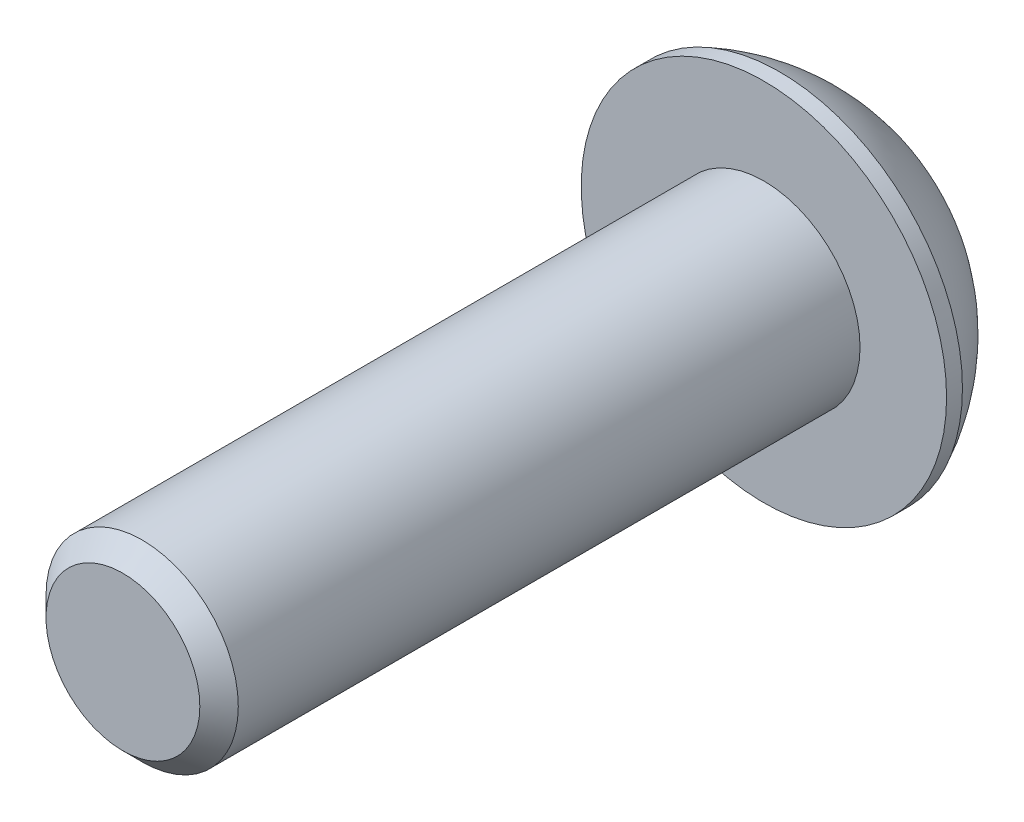
ISO-10303-21;
HEADER;
FILE_DESCRIPTION(('STEP AP214'),'2;1');
FILE_NAME('part.step','',(''),(''),'','','');
FILE_SCHEMA(('AUTOMOTIVE_DESIGN { 1 0 10303 214 1 1 1 1 }'));
ENDSEC;
DATA;
#1=APPLICATION_CONTEXT('core data for automotive mechanical design processes');
#2=APPLICATION_PROTOCOL_DEFINITION('international standard','automotive_design',2000,#1);
#3=PRODUCT_CONTEXT('',#1,'mechanical');
#4=PRODUCT('Part','Part','',(#3));
#5=PRODUCT_RELATED_PRODUCT_CATEGORY('part','',(#4));
#6=PRODUCT_DEFINITION_FORMATION('','',#4);
#7=PRODUCT_DEFINITION_CONTEXT('part definition',#1,'design');
#8=PRODUCT_DEFINITION('design','',#6,#7);
#9=PRODUCT_DEFINITION_SHAPE('','',#8);
#10=(LENGTH_UNIT() NAMED_UNIT(*) SI_UNIT(.MILLI.,.METRE.));
#11=(NAMED_UNIT(*) PLANE_ANGLE_UNIT() SI_UNIT($,.RADIAN.));
#12=(NAMED_UNIT(*) SI_UNIT($,.STERADIAN.) SOLID_ANGLE_UNIT());
#13=UNCERTAINTY_MEASURE_WITH_UNIT(LENGTH_MEASURE(1.E-05),#10,'distance_accuracy_value','');
#14=(GEOMETRIC_REPRESENTATION_CONTEXT(3) GLOBAL_UNCERTAINTY_ASSIGNED_CONTEXT((#13)) GLOBAL_UNIT_ASSIGNED_CONTEXT((#10,
#11,#12)) REPRESENTATION_CONTEXT('',''));
#15=CARTESIAN_POINT('',(0.,0.,0.));
#16=DIRECTION('',(0.,0.,1.));
#17=DIRECTION('',(1.,0.,0.));
#18=AXIS2_PLACEMENT_3D('',#15,#16,#17);
#19=CARTESIAN_POINT('',(0.,-1.15470053837925,1.155));
#20=DIRECTION('',(-0.5,-0.866025403784439,0.));
#21=DIRECTION('',(-0.866025403784439,0.5,0.));
#22=AXIS2_PLACEMENT_3D('',#19,#20,#21);
#23=PLANE('',#22);
#24=DIRECTION('',(0.,0.,-1.));
#25=VECTOR('',#24,1.);
#26=CARTESIAN_POINT('',(0.,-1.15470053837925,1.155));
#27=LINE('',#26,#25);
#28=CARTESIAN_POINT('',(0.,-1.15470053837925,1.155));
#29=VERTEX_POINT('',#28);
#30=CARTESIAN_POINT('',(0.,-1.15470053837925,0.));
#31=VERTEX_POINT('',#30);
#32=EDGE_CURVE('E11',#29,#31,#27,.T.);
#33=ORIENTED_EDGE('',*,*,#32,.T.);
#34=CARTESIAN_POINT('',(0.,-1.15470053837922,0.));
#35=CARTESIAN_POINT('',(-0.500000000000002,-0.866025403784439,0.288675134594791));
#36=CARTESIAN_POINT('',(-0.999999999999949,-0.577350269189654,0.));
#37=(BOUNDED_CURVE() B_SPLINE_CURVE(2,(#34,#35,#36),.UNSPECIFIED.,.F.,
.F.) B_SPLINE_CURVE_WITH_KNOTS((3,3),(-0.321867155116299,-0.124274873543865),
.UNSPECIFIED.) CURVE() GEOMETRIC_REPRESENTATION_ITEM() RATIONAL_B_SPLINE_CURVE((1.46410161513778,
1.69059892324148,1.46410161513778)) REPRESENTATION_ITEM(''));
#38=CARTESIAN_POINT('',(-1.,-0.577350269189626,0.));
#39=VERTEX_POINT('',#38);
#40=EDGE_CURVE('E220',#31,#39,#37,.T.);
#41=ORIENTED_EDGE('',*,*,#40,.T.);
#42=DIRECTION('',(0.,0.,-1.));
#43=VECTOR('',#42,1.);
#44=CARTESIAN_POINT('',(-1.,-0.577350269189626,1.155));
#45=LINE('',#44,#43);
#46=CARTESIAN_POINT('',(-1.,-0.577350269189626,1.155));
#47=VERTEX_POINT('',#46);
#48=EDGE_CURVE('E250',#47,#39,#45,.T.);
#49=ORIENTED_EDGE('',*,*,#48,.F.);
#50=DIRECTION('',(-0.866025403784439,0.5,0.));
#51=VECTOR('',#50,1.);
#52=CARTESIAN_POINT('',(0.,-1.15470053837925,1.155));
#53=LINE('',#52,#51);
#54=EDGE_CURVE('E229',#29,#47,#53,.T.);
#55=ORIENTED_EDGE('',*,*,#54,.F.);
#56=EDGE_LOOP('',(#33,#41,#49,#55));
#57=FACE_BOUND('',#56,.T.);
#58=ADVANCED_FACE('F17',(#57),#23,.F.);
#59=CARTESIAN_POINT('',(1.,-0.577350269189626,1.155));
#60=DIRECTION('',(0.5,-0.866025403784439,0.));
#61=DIRECTION('',(0.,0.,-1.));
#62=AXIS2_PLACEMENT_3D('',#59,#60,#61);
#63=PLANE('',#62);
#64=DIRECTION('',(0.,0.,-1.));
#65=VECTOR('',#64,1.);
#66=CARTESIAN_POINT('',(1.,-0.577350269189626,1.155));
#67=LINE('',#66,#65);
#68=CARTESIAN_POINT('',(1.,-0.577350269189626,1.155));
#69=VERTEX_POINT('',#68);
#70=CARTESIAN_POINT('',(1.,-0.577350269189626,0.));
#71=VERTEX_POINT('',#70);
#72=EDGE_CURVE('E25',#69,#71,#67,.T.);
#73=ORIENTED_EDGE('',*,*,#72,.T.);
#74=CARTESIAN_POINT('',(0.999999999999948,-0.577350269189655,0.));
#75=CARTESIAN_POINT('',(0.5,-0.866025403784439,0.288675134594789));
#76=CARTESIAN_POINT('',(0.,-1.15470053837922,0.));
#77=(BOUNDED_CURVE() B_SPLINE_CURVE(2,(#74,#75,#76),.UNSPECIFIED.,.F.,
.F.) B_SPLINE_CURVE_WITH_KNOTS((3,3),(-0.321867155116299,-0.124274873543865),
.UNSPECIFIED.) CURVE() GEOMETRIC_REPRESENTATION_ITEM() RATIONAL_B_SPLINE_CURVE((1.46410161513778,
1.69059892324148,1.46410161513778)) REPRESENTATION_ITEM(''));
#78=EDGE_CURVE('E211',#71,#31,#77,.T.);
#79=ORIENTED_EDGE('',*,*,#78,.T.);
#80=ORIENTED_EDGE('',*,*,#32,.F.);
#81=DIRECTION('',(-0.866025403784439,-0.5,0.));
#82=VECTOR('',#81,1.);
#83=CARTESIAN_POINT('',(1.,-0.577350269189626,1.155));
#84=LINE('',#83,#82);
#85=EDGE_CURVE('E138',#69,#29,#84,.T.);
#86=ORIENTED_EDGE('',*,*,#85,.F.);
#87=EDGE_LOOP('',(#73,#79,#80,#86));
#88=FACE_BOUND('',#87,.T.);
#89=ADVANCED_FACE('F264',(#88),#63,.F.);
#90=CARTESIAN_POINT('',(1.,0.577350269189626,1.155));
#91=DIRECTION('',(1.,0.,0.));
#92=DIRECTION('',(0.,0.,1.));
#93=AXIS2_PLACEMENT_3D('',#90,#91,#92);
#94=PLANE('',#93);
#95=DIRECTION('',(0.,0.,-1.));
#96=VECTOR('',#95,1.);
#97=CARTESIAN_POINT('',(1.,0.577350269189626,1.155));
#98=LINE('',#97,#96);
#99=CARTESIAN_POINT('',(1.,0.577350269189626,1.155));
#100=VERTEX_POINT('',#99);
#101=CARTESIAN_POINT('',(1.,0.577350269189626,0.));
#102=VERTEX_POINT('',#101);
#103=EDGE_CURVE('E46',#100,#102,#98,.T.);
#104=ORIENTED_EDGE('',*,*,#103,.T.);
#105=CARTESIAN_POINT('',(1.,0.577350269189569,0.));
#106=CARTESIAN_POINT('',(1.,0.,0.288675134594791));
#107=CARTESIAN_POINT('',(1.,-0.577350269189568,0.));
#108=(BOUNDED_CURVE() B_SPLINE_CURVE(2,(#105,#106,#107),.UNSPECIFIED.,.F.,
.F.) B_SPLINE_CURVE_WITH_KNOTS((3,3),(-0.3218671551163,-0.124274873543865),
.UNSPECIFIED.) CURVE() GEOMETRIC_REPRESENTATION_ITEM() RATIONAL_B_SPLINE_CURVE((1.46410161513777,
1.69059892324148,1.46410161513777)) REPRESENTATION_ITEM(''));
#109=EDGE_CURVE('E203',#102,#71,#108,.T.);
#110=ORIENTED_EDGE('',*,*,#109,.T.);
#111=ORIENTED_EDGE('',*,*,#72,.F.);
#112=DIRECTION('',(0.,-1.,0.));
#113=VECTOR('',#112,1.);
#114=CARTESIAN_POINT('',(1.,0.577350269189626,1.155));
#115=LINE('',#114,#113);
#116=EDGE_CURVE('E135',#100,#69,#115,.T.);
#117=ORIENTED_EDGE('',*,*,#116,.F.);
#118=EDGE_LOOP('',(#104,#110,#111,#117));
#119=FACE_BOUND('',#118,.T.);
#120=ADVANCED_FACE('F270',(#119),#94,.F.);
#121=CARTESIAN_POINT('',(0.,1.15470053837925,1.155));
#122=DIRECTION('',(0.5,0.866025403784439,0.));
#123=DIRECTION('',(0.,0.,-1.));
#124=AXIS2_PLACEMENT_3D('',#121,#122,#123);
#125=PLANE('',#124);
#126=DIRECTION('',(0.,0.,-1.));
#127=VECTOR('',#126,1.);
#128=CARTESIAN_POINT('',(0.,1.15470053837925,1.155));
#129=LINE('',#128,#127);
#130=CARTESIAN_POINT('',(0.,1.15470053837925,1.155));
#131=VERTEX_POINT('',#130);
#132=CARTESIAN_POINT('',(0.,1.15470053837925,0.));
#133=VERTEX_POINT('',#132);
#134=EDGE_CURVE('E256',#131,#133,#129,.T.);
#135=ORIENTED_EDGE('',*,*,#134,.T.);
#136=CARTESIAN_POINT('',(0.,1.15470053837922,0.));
#137=CARTESIAN_POINT('',(0.5,0.866025403784439,0.288675134594791));
#138=CARTESIAN_POINT('',(0.999999999999951,0.577350269189654,0.));
#139=(BOUNDED_CURVE() B_SPLINE_CURVE(2,(#136,#137,#138),.UNSPECIFIED.,.F.,
.F.) B_SPLINE_CURVE_WITH_KNOTS((3,3),(-0.3218671551163,-0.124274873543865),
.UNSPECIFIED.) CURVE() GEOMETRIC_REPRESENTATION_ITEM() RATIONAL_B_SPLINE_CURVE((1.46410161513778,
1.69059892324148,1.46410161513778)) REPRESENTATION_ITEM(''));
#140=EDGE_CURVE('E195',#133,#102,#139,.T.);
#141=ORIENTED_EDGE('',*,*,#140,.T.);
#142=ORIENTED_EDGE('',*,*,#103,.F.);
#143=DIRECTION('',(0.866025403784439,-0.5,0.));
#144=VECTOR('',#143,1.);
#145=CARTESIAN_POINT('',(0.,1.15470053837925,1.155));
#146=LINE('',#145,#144);
#147=EDGE_CURVE('E139',#131,#100,#146,.T.);
#148=ORIENTED_EDGE('',*,*,#147,.F.);
#149=EDGE_LOOP('',(#135,#141,#142,#148));
#150=FACE_BOUND('',#149,.T.);
#151=ADVANCED_FACE('F312',(#150),#125,.F.);
#152=CARTESIAN_POINT('',(-1.,0.577350269189626,1.155));
#153=DIRECTION('',(-0.5,0.866025403784439,0.));
#154=DIRECTION('',(0.,0.,1.));
#155=AXIS2_PLACEMENT_3D('',#152,#153,#154);
#156=PLANE('',#155);
#157=DIRECTION('',(0.,0.,-1.));
#158=VECTOR('',#157,1.);
#159=CARTESIAN_POINT('',(-1.,0.577350269189626,1.155));
#160=LINE('',#159,#158);
#161=CARTESIAN_POINT('',(-1.,0.577350269189626,1.155));
#162=VERTEX_POINT('',#161);
#163=CARTESIAN_POINT('',(-1.,0.577350269189626,0.));
#164=VERTEX_POINT('',#163);
#165=EDGE_CURVE('E253',#162,#164,#160,.T.);
#166=ORIENTED_EDGE('',*,*,#165,.T.);
#167=CARTESIAN_POINT('',(-0.999999999999952,0.577350269189653,0.));
#168=CARTESIAN_POINT('',(-0.5,0.866025403784439,0.288675134594791));
#169=CARTESIAN_POINT('',(0.,1.15470053837922,0.));
#170=(BOUNDED_CURVE() B_SPLINE_CURVE(2,(#167,#168,#169),.UNSPECIFIED.,.F.,
.F.) B_SPLINE_CURVE_WITH_KNOTS((3,3),(-0.3218671551163,-0.124274873543865),
.UNSPECIFIED.) CURVE() GEOMETRIC_REPRESENTATION_ITEM() RATIONAL_B_SPLINE_CURVE((1.46410161513778,
1.69059892324148,1.46410161513778)) REPRESENTATION_ITEM(''));
#171=EDGE_CURVE('E162',#164,#133,#170,.T.);
#172=ORIENTED_EDGE('',*,*,#171,.T.);
#173=ORIENTED_EDGE('',*,*,#134,.F.);
#174=DIRECTION('',(0.866025403784439,0.5,0.));
#175=VECTOR('',#174,1.);
#176=CARTESIAN_POINT('',(-1.,0.577350269189626,1.155));
#177=LINE('',#176,#175);
#178=EDGE_CURVE('E240',#162,#131,#177,.T.);
#179=ORIENTED_EDGE('',*,*,#178,.F.);
#180=EDGE_LOOP('',(#166,#172,#173,#179));
#181=FACE_BOUND('',#180,.T.);
#182=ADVANCED_FACE('F316',(#181),#156,.F.);
#183=CARTESIAN_POINT('',(-1.,-0.577350269189626,1.155));
#184=DIRECTION('',(-1.,0.,0.));
#185=DIRECTION('',(0.,0.,1.));
#186=AXIS2_PLACEMENT_3D('',#183,#184,#185);
#187=PLANE('',#186);
#188=ORIENTED_EDGE('',*,*,#48,.T.);
#189=CARTESIAN_POINT('',(-1.,-0.577350269189568,0.));
#190=CARTESIAN_POINT('',(-1.,0.,0.288675134594789));
#191=CARTESIAN_POINT('',(-1.,0.577350269189568,0.));
#192=(BOUNDED_CURVE() B_SPLINE_CURVE(2,(#189,#190,#191),.UNSPECIFIED.,.F.,
.F.) B_SPLINE_CURVE_WITH_KNOTS((3,3),(-0.321867155116299,-0.124274873543865),
.UNSPECIFIED.) CURVE() GEOMETRIC_REPRESENTATION_ITEM() RATIONAL_B_SPLINE_CURVE((1.46410161513777,
1.69059892324148,1.46410161513777)) REPRESENTATION_ITEM(''));
#193=EDGE_CURVE('E146',#39,#164,#192,.T.);
#194=ORIENTED_EDGE('',*,*,#193,.T.);
#195=ORIENTED_EDGE('',*,*,#165,.F.);
#196=DIRECTION('',(0.,1.,0.));
#197=VECTOR('',#196,1.);
#198=CARTESIAN_POINT('',(-1.,-0.577350269189626,1.155));
#199=LINE('',#198,#197);
#200=EDGE_CURVE('E236',#47,#162,#199,.T.);
#201=ORIENTED_EDGE('',*,*,#200,.F.);
#202=EDGE_LOOP('',(#188,#194,#195,#201));
#203=FACE_BOUND('',#202,.T.);
#204=ADVANCED_FACE('F307',(#203),#187,.F.);
#205=CARTESIAN_POINT('',(-1.,-0.577350269189625,1.155));
#206=DIRECTION('',(0.,0.,-1.));
#207=DIRECTION('',(0.,-1.,0.));
#208=AXIS2_PLACEMENT_3D('',#205,#206,#207);
#209=PLANE('',#208);
#210=ORIENTED_EDGE('',*,*,#54,.T.);
#211=ORIENTED_EDGE('',*,*,#200,.T.);
#212=ORIENTED_EDGE('',*,*,#178,.T.);
#213=ORIENTED_EDGE('',*,*,#147,.T.);
#214=ORIENTED_EDGE('',*,*,#116,.T.);
#215=ORIENTED_EDGE('',*,*,#85,.T.);
#216=EDGE_LOOP('',(#210,#211,#212,#213,#214,#215));
#217=FACE_BOUND('',#216,.T.);
#218=ADVANCED_FACE('F311',(#217),#209,.T.);
#219=CARTESIAN_POINT('',(0.,0.,0.));
#220=DIRECTION('',(0.,0.,-1.));
#221=DIRECTION('',(-1.,0.,0.));
#222=AXIS2_PLACEMENT_3D('',#219,#220,#221);
#223=CONICAL_SURFACE('',#222,1.15470053837925,0.78539816339745);
#224=CARTESIAN_POINT('',(0.,0.,0.));
#225=DIRECTION('',(0.,0.,-1.));
#226=DIRECTION('',(-1.,0.,0.));
#227=AXIS2_PLACEMENT_3D('',#224,#225,#226);
#228=CIRCLE('',#227,1.15470053837925);
#229=EDGE_CURVE('E163',#31,#39,#228,.T.);
#230=ORIENTED_EDGE('',*,*,#229,.T.);
#231=ORIENTED_EDGE('',*,*,#40,.F.);
#232=EDGE_LOOP('',(#230,#231));
#233=FACE_BOUND('',#232,.T.);
#234=ADVANCED_FACE('F290',(#233),#223,.F.);
#235=CARTESIAN_POINT('',(0.,0.,0.));
#236=DIRECTION('',(0.,0.,-1.));
#237=DIRECTION('',(-1.,0.,0.));
#238=AXIS2_PLACEMENT_3D('',#235,#236,#237);
#239=CONICAL_SURFACE('',#238,1.15470053837925,0.78539816339745);
#240=CARTESIAN_POINT('',(0.,0.,0.));
#241=DIRECTION('',(0.,0.,-1.));
#242=DIRECTION('',(-1.,0.,0.));
#243=AXIS2_PLACEMENT_3D('',#240,#241,#242);
#244=CIRCLE('',#243,1.15470053837925);
#245=EDGE_CURVE('E158',#71,#31,#244,.T.);
#246=ORIENTED_EDGE('',*,*,#245,.T.);
#247=ORIENTED_EDGE('',*,*,#78,.F.);
#248=EDGE_LOOP('',(#246,#247));
#249=FACE_BOUND('',#248,.T.);
#250=ADVANCED_FACE('F266',(#249),#239,.F.);
#251=CARTESIAN_POINT('',(0.,0.,0.));
#252=DIRECTION('',(0.,0.,-1.));
#253=DIRECTION('',(1.,0.,0.));
#254=AXIS2_PLACEMENT_3D('',#251,#252,#253);
#255=CONICAL_SURFACE('',#254,1.15470053837925,0.78539816339745);
#256=CARTESIAN_POINT('',(0.,0.,0.));
#257=DIRECTION('',(0.,0.,-1.));
#258=DIRECTION('',(-1.,0.,0.));
#259=AXIS2_PLACEMENT_3D('',#256,#257,#258);
#260=CIRCLE('',#259,1.15470053837925);
#261=EDGE_CURVE('E175',#102,#71,#260,.T.);
#262=ORIENTED_EDGE('',*,*,#261,.T.);
#263=ORIENTED_EDGE('',*,*,#109,.F.);
#264=EDGE_LOOP('',(#262,#263));
#265=FACE_BOUND('',#264,.T.);
#266=ADVANCED_FACE('F278',(#265),#255,.F.);
#267=CARTESIAN_POINT('',(0.,0.,0.));
#268=DIRECTION('',(0.,0.,-1.));
#269=DIRECTION('',(-1.,0.,0.));
#270=AXIS2_PLACEMENT_3D('',#267,#268,#269);
#271=CONICAL_SURFACE('',#270,1.15470053837925,0.78539816339745);
#272=CARTESIAN_POINT('',(0.,0.,0.));
#273=DIRECTION('',(0.,0.,-1.));
#274=DIRECTION('',(-1.,0.,0.));
#275=AXIS2_PLACEMENT_3D('',#272,#273,#274);
#276=CIRCLE('',#275,1.15470053837925);
#277=EDGE_CURVE('E179',#133,#102,#276,.T.);
#278=ORIENTED_EDGE('',*,*,#277,.T.);
#279=ORIENTED_EDGE('',*,*,#140,.F.);
#280=EDGE_LOOP('',(#278,#279));
#281=FACE_BOUND('',#280,.T.);
#282=ADVANCED_FACE('F280',(#281),#271,.F.);
#283=CARTESIAN_POINT('',(0.,0.,0.));
#284=DIRECTION('',(0.,0.,-1.));
#285=DIRECTION('',(-1.,0.,0.));
#286=AXIS2_PLACEMENT_3D('',#283,#284,#285);
#287=CONICAL_SURFACE('',#286,1.15470053837925,0.78539816339745);
#288=CARTESIAN_POINT('',(0.,0.,0.));
#289=DIRECTION('',(0.,0.,-1.));
#290=DIRECTION('',(-1.,0.,0.));
#291=AXIS2_PLACEMENT_3D('',#288,#289,#290);
#292=CIRCLE('',#291,1.15470053837925);
#293=EDGE_CURVE('E183',#164,#133,#292,.T.);
#294=ORIENTED_EDGE('',*,*,#293,.T.);
#295=ORIENTED_EDGE('',*,*,#171,.F.);
#296=EDGE_LOOP('',(#294,#295));
#297=FACE_BOUND('',#296,.T.);
#298=ADVANCED_FACE('F287',(#297),#287,.F.);
#299=CARTESIAN_POINT('',(0.,-2.85,1.65));
#300=DIRECTION('',(0.,0.,-1.));
#301=DIRECTION('',(0.,-1.,0.));
#302=AXIS2_PLACEMENT_3D('',#299,#300,#301);
#303=PLANE('',#302);
#304=CARTESIAN_POINT('',(0.,0.,1.65));
#305=DIRECTION('',(0.,0.,-1.));
#306=DIRECTION('',(-1.,0.,0.));
#307=AXIS2_PLACEMENT_3D('',#304,#305,#306);
#308=CIRCLE('',#307,1.5);
#309=CARTESIAN_POINT('',(1.5,0.,1.65));
#310=VERTEX_POINT('',#309);
#311=EDGE_CURVE('E117',#310,#310,#308,.T.);
#312=ORIENTED_EDGE('',*,*,#311,.T.);
#313=EDGE_LOOP('',(#312));
#314=FACE_BOUND('',#313,.T.);
#315=CARTESIAN_POINT('',(0.,0.,1.65));
#316=DIRECTION('',(0.,0.,-1.));
#317=DIRECTION('',(-1.,0.,0.));
#318=AXIS2_PLACEMENT_3D('',#315,#316,#317);
#319=CIRCLE('',#318,2.85);
#320=CARTESIAN_POINT('',(2.85,0.,1.65));
#321=VERTEX_POINT('',#320);
#322=EDGE_CURVE('E143',#321,#321,#319,.T.);
#323=ORIENTED_EDGE('',*,*,#322,.F.);
#324=EDGE_LOOP('',(#323));
#325=FACE_BOUND('',#324,.T.);
#326=ADVANCED_FACE('F319',(#314,#325),#303,.F.);
#327=CARTESIAN_POINT('',(0.,-1.5,0.));
#328=DIRECTION('',(0.,0.,1.));
#329=DIRECTION('',(1.,0.,0.));
#330=AXIS2_PLACEMENT_3D('',#327,#328,#329);
#331=PLANE('',#330);
#332=ORIENTED_EDGE('',*,*,#261,.F.);
#333=ORIENTED_EDGE('',*,*,#277,.F.);
#334=ORIENTED_EDGE('',*,*,#293,.F.);
#335=CARTESIAN_POINT('',(0.,0.,0.));
#336=DIRECTION('',(0.,0.,-1.));
#337=DIRECTION('',(-1.,0.,0.));
#338=AXIS2_PLACEMENT_3D('',#335,#336,#337);
#339=CIRCLE('',#338,1.15470053837925);
#340=EDGE_CURVE('E152',#39,#164,#339,.T.);
#341=ORIENTED_EDGE('',*,*,#340,.F.);
#342=ORIENTED_EDGE('',*,*,#229,.F.);
#343=ORIENTED_EDGE('',*,*,#245,.F.);
#344=EDGE_LOOP('',(#332,#333,#334,#341,#342,#343));
#345=FACE_BOUND('',#344,.T.);
#346=CARTESIAN_POINT('',(0.,0.,0.));
#347=DIRECTION('',(0.,0.,-1.));
#348=DIRECTION('',(-1.,0.,0.));
#349=AXIS2_PLACEMENT_3D('',#346,#347,#348);
#350=CIRCLE('',#349,1.5);
#351=CARTESIAN_POINT('',(0.,-1.5,0.));
#352=VERTEX_POINT('',#351);
#353=EDGE_CURVE('E172',#352,#352,#350,.T.);
#354=ORIENTED_EDGE('',*,*,#353,.T.);
#355=EDGE_LOOP('',(#354));
#356=FACE_BOUND('',#355,.T.);
#357=ADVANCED_FACE('F274',(#345,#356),#331,.F.);
#358=CARTESIAN_POINT('',(0.,0.,2.79483288770053));
#359=DIRECTION('',(-1.,0.,0.));
#360=DIRECTION('',(0.,-1.,0.));
#361=AXIS2_PLACEMENT_3D('',#358,#359,#360);
#362=SPHERICAL_SURFACE('',#361,3.17192226735973);
#363=CARTESIAN_POINT('',(0.,0.,2.79483288770053));
#364=DIRECTION('',(0.,0.,-1.));
#365=DIRECTION('',(-1.,0.,0.));
#366=AXIS2_PLACEMENT_3D('',#363,#364,#365);
#367=SPHERICAL_SURFACE('',#366,3.17192226735973);
#368=ORIENTED_EDGE('',*,*,#353,.F.);
#369=EDGE_LOOP('',(#368));
#370=FACE_BOUND('',#369,.T.);
#371=CARTESIAN_POINT('',(0.,0.,1.4025));
#372=DIRECTION('',(0.,0.,-1.));
#373=DIRECTION('',(-1.,0.,0.));
#374=AXIS2_PLACEMENT_3D('',#371,#372,#373);
#375=CIRCLE('',#374,2.85);
#376=CARTESIAN_POINT('',(2.85,0.,1.4025));
#377=VERTEX_POINT('',#376);
#378=EDGE_CURVE('E144',#377,#377,#375,.T.);
#379=ORIENTED_EDGE('',*,*,#378,.T.);
#380=EDGE_LOOP('',(#379));
#381=FACE_BOUND('',#380,.T.);
#382=ADVANCED_FACE('F330',(#370,#381),#367,.T.);
#383=CARTESIAN_POINT('',(0.,0.,0.));
#384=DIRECTION('',(0.,0.,-1.));
#385=DIRECTION('',(-1.,0.,0.));
#386=AXIS2_PLACEMENT_3D('',#383,#384,#385);
#387=CYLINDRICAL_SURFACE('',#386,2.85);
#388=ORIENTED_EDGE('',*,*,#378,.F.);
#389=DIRECTION('',(0.,0.,1.));
#390=VECTOR('',#389,1.);
#391=CARTESIAN_POINT('',(2.85,0.,0.));
#392=LINE('',#391,#390);
#393=EDGE_CURVE('E140',#377,#321,#392,.T.);
#394=ORIENTED_EDGE('',*,*,#393,.T.);
#395=ORIENTED_EDGE('',*,*,#322,.T.);
#396=ORIENTED_EDGE('',*,*,#393,.F.);
#397=EDGE_LOOP('',(#388,#394,#395,#396));
#398=FACE_BOUND('',#397,.T.);
#399=ADVANCED_FACE('F331',(#398),#387,.T.);
#400=CARTESIAN_POINT('',(0.,0.,0.));
#401=DIRECTION('',(0.,0.,-1.));
#402=DIRECTION('',(-1.,0.,0.));
#403=AXIS2_PLACEMENT_3D('',#400,#401,#402);
#404=CONICAL_SURFACE('',#403,1.15470053837925,0.78539816339745);
#405=ORIENTED_EDGE('',*,*,#193,.F.);
#406=ORIENTED_EDGE('',*,*,#340,.T.);
#407=EDGE_LOOP('',(#405,#406));
#408=FACE_BOUND('',#407,.T.);
#409=ADVANCED_FACE('F305',(#408),#404,.F.);
#410=CARTESIAN_POINT('',(0.,0.,11.65));
#411=DIRECTION('',(0.,0.,1.));
#412=DIRECTION('',(1.,0.,0.));
#413=AXIS2_PLACEMENT_3D('',#410,#411,#412);
#414=PLANE('',#413);
#415=CARTESIAN_POINT('',(0.,0.,11.65));
#416=DIRECTION('',(0.,0.,-1.));
#417=DIRECTION('',(-1.,0.,0.));
#418=AXIS2_PLACEMENT_3D('',#415,#416,#417);
#419=CIRCLE('',#418,1.2);
#420=CARTESIAN_POINT('',(1.2,0.,11.65));
#421=VERTEX_POINT('',#420);
#422=EDGE_CURVE('E119',#421,#421,#419,.T.);
#423=ORIENTED_EDGE('',*,*,#422,.F.);
#424=EDGE_LOOP('',(#423));
#425=FACE_BOUND('',#424,.T.);
#426=ADVANCED_FACE('F337',(#425),#414,.T.);
#427=CARTESIAN_POINT('',(0.,0.,1.65));
#428=DIRECTION('',(0.,0.,1.));
#429=DIRECTION('',(-1.,0.,0.));
#430=AXIS2_PLACEMENT_3D('',#427,#428,#429);
#431=CYLINDRICAL_SURFACE('',#430,1.5);
#432=CARTESIAN_POINT('',(0.,0.,11.35));
#433=DIRECTION('',(0.,0.,1.));
#434=DIRECTION('',(-1.,0.,0.));
#435=AXIS2_PLACEMENT_3D('',#432,#433,#434);
#436=CIRCLE('',#435,1.5);
#437=CARTESIAN_POINT('',(1.5,0.,11.35));
#438=VERTEX_POINT('',#437);
#439=EDGE_CURVE('E116',#438,#438,#436,.T.);
#440=ORIENTED_EDGE('',*,*,#439,.F.);
#441=DIRECTION('',(0.,0.,-1.));
#442=VECTOR('',#441,1.);
#443=CARTESIAN_POINT('',(1.5,0.,1.65));
#444=LINE('',#443,#442);
#445=EDGE_CURVE('E112',#438,#310,#444,.T.);
#446=ORIENTED_EDGE('',*,*,#445,.T.);
#447=ORIENTED_EDGE('',*,*,#311,.F.);
#448=ORIENTED_EDGE('',*,*,#445,.F.);
#449=EDGE_LOOP('',(#440,#446,#447,#448));
#450=FACE_BOUND('',#449,.T.);
#451=ADVANCED_FACE('F114',(#450),#431,.T.);
#452=CARTESIAN_POINT('',(0.,0.,11.5));
#453=DIRECTION('',(0.,0.,-1.));
#454=DIRECTION('',(-1.,0.,0.));
#455=AXIS2_PLACEMENT_3D('',#452,#453,#454);
#456=CONICAL_SURFACE('',#455,1.35,0.785398163397448);
#457=ORIENTED_EDGE('',*,*,#439,.T.);
#458=DIRECTION('',(-0.707106781186547,0.,0.707106781186548));
#459=VECTOR('',#458,1.);
#460=CARTESIAN_POINT('',(1.35,0.,11.5));
#461=LINE('',#460,#459);
#462=EDGE_CURVE('E123',#438,#421,#461,.T.);
#463=ORIENTED_EDGE('',*,*,#462,.T.);
#464=ORIENTED_EDGE('',*,*,#422,.T.);
#465=ORIENTED_EDGE('',*,*,#462,.F.);
#466=EDGE_LOOP('',(#457,#463,#464,#465));
#467=FACE_BOUND('',#466,.T.);
#468=ADVANCED_FACE('F124',(#467),#456,.T.);
#469=CLOSED_SHELL('',(#58,#89,#120,#151,#182,#204,#218,#234,#250,#266,#282,#298,#326,#357,#382,
#399,#409,#426,#451,#468));
#470=MANIFOLD_SOLID_BREP('B1',#469);
#471=ADVANCED_BREP_SHAPE_REPRESENTATION('',(#18,#470),#14);
#472=SHAPE_DEFINITION_REPRESENTATION(#9,#471);
ENDSEC;
END-ISO-10303-21;
